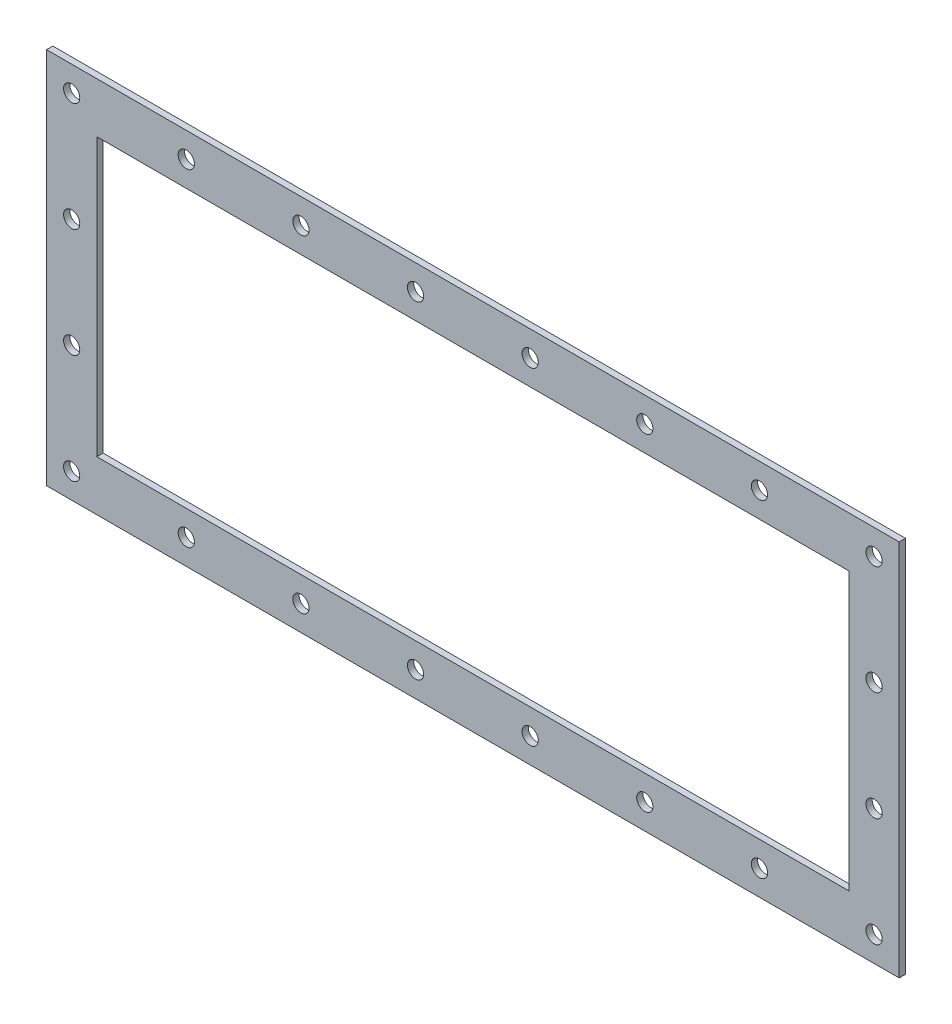
ISO-10303-21;
HEADER;
FILE_DESCRIPTION(('STEP AP214'),'2;1');
FILE_NAME('part.step','',(''),(''),'','','');
FILE_SCHEMA(('AUTOMOTIVE_DESIGN { 1 0 10303 214 1 1 1 1 }'));
ENDSEC;
DATA;
#1=APPLICATION_CONTEXT('core data for automotive mechanical design processes');
#2=APPLICATION_PROTOCOL_DEFINITION('international standard','automotive_design',2000,#1);
#3=PRODUCT_CONTEXT('',#1,'mechanical');
#4=PRODUCT('Part','Part','',(#3));
#5=PRODUCT_RELATED_PRODUCT_CATEGORY('part','',(#4));
#6=PRODUCT_DEFINITION_FORMATION('','',#4);
#7=PRODUCT_DEFINITION_CONTEXT('part definition',#1,'design');
#8=PRODUCT_DEFINITION('design','',#6,#7);
#9=PRODUCT_DEFINITION_SHAPE('','',#8);
#10=(LENGTH_UNIT() NAMED_UNIT(*) SI_UNIT(.MILLI.,.METRE.));
#11=(NAMED_UNIT(*) PLANE_ANGLE_UNIT() SI_UNIT($,.RADIAN.));
#12=(NAMED_UNIT(*) SI_UNIT($,.STERADIAN.) SOLID_ANGLE_UNIT());
#13=UNCERTAINTY_MEASURE_WITH_UNIT(LENGTH_MEASURE(1.E-05),#10,'distance_accuracy_value','');
#14=(GEOMETRIC_REPRESENTATION_CONTEXT(3) GLOBAL_UNCERTAINTY_ASSIGNED_CONTEXT((#13)) GLOBAL_UNIT_ASSIGNED_CONTEXT((#10,
#11,#12)) REPRESENTATION_CONTEXT('',''));
#15=CARTESIAN_POINT('',(0.,0.,0.));
#16=DIRECTION('',(0.,0.,1.));
#17=DIRECTION('',(1.,0.,0.));
#18=AXIS2_PLACEMENT_3D('',#15,#16,#17);
#19=CARTESIAN_POINT('',(0.,17.5,0.79375));
#20=DIRECTION('',(0.,1.,0.));
#21=DIRECTION('',(0.,0.,1.));
#22=AXIS2_PLACEMENT_3D('',#19,#20,#21);
#23=PLANE('',#22);
#24=DIRECTION('',(1.,0.,0.));
#25=VECTOR('',#24,1.);
#26=CARTESIAN_POINT('',(0.,17.5,0.));
#27=LINE('',#26,#25);
#28=CARTESIAN_POINT('',(-47.5,17.5,0.));
#29=VERTEX_POINT('',#28);
#30=CARTESIAN_POINT('',(47.5,17.5,0.));
#31=VERTEX_POINT('',#30);
#32=EDGE_CURVE('E243',#29,#31,#27,.T.);
#33=ORIENTED_EDGE('',*,*,#32,.T.);
#34=DIRECTION('',(0.,0.,-1.));
#35=VECTOR('',#34,1.);
#36=CARTESIAN_POINT('',(47.5,17.5,0.79375));
#37=LINE('',#36,#35);
#38=CARTESIAN_POINT('',(47.5,17.5,0.79375));
#39=VERTEX_POINT('',#38);
#40=EDGE_CURVE('E11',#39,#31,#37,.T.);
#41=ORIENTED_EDGE('',*,*,#40,.F.);
#42=DIRECTION('',(1.,0.,0.));
#43=VECTOR('',#42,1.);
#44=CARTESIAN_POINT('',(0.,17.5,0.79375));
#45=LINE('',#44,#43);
#46=CARTESIAN_POINT('',(-47.5,17.5,0.79375));
#47=VERTEX_POINT('',#46);
#48=EDGE_CURVE('E126',#47,#39,#45,.T.);
#49=ORIENTED_EDGE('',*,*,#48,.F.);
#50=DIRECTION('',(0.,0.,-1.));
#51=VECTOR('',#50,1.);
#52=CARTESIAN_POINT('',(-47.5,17.5,0.79375));
#53=LINE('',#52,#51);
#54=EDGE_CURVE('E65',#47,#29,#53,.T.);
#55=ORIENTED_EDGE('',*,*,#54,.T.);
#56=EDGE_LOOP('',(#33,#41,#49,#55));
#57=FACE_BOUND('',#56,.T.);
#58=ADVANCED_FACE('F45',(#57),#23,.F.);
#59=CARTESIAN_POINT('',(47.5,0.,0.79375));
#60=DIRECTION('',(1.,0.,0.));
#61=DIRECTION('',(0.,1.,0.));
#62=AXIS2_PLACEMENT_3D('',#59,#60,#61);
#63=PLANE('',#62);
#64=DIRECTION('',(0.,-1.,0.));
#65=VECTOR('',#64,1.);
#66=CARTESIAN_POINT('',(47.5,0.,0.));
#67=LINE('',#66,#65);
#68=CARTESIAN_POINT('',(47.5,-17.5,0.));
#69=VERTEX_POINT('',#68);
#70=EDGE_CURVE('E133',#31,#69,#67,.T.);
#71=ORIENTED_EDGE('',*,*,#70,.T.);
#72=DIRECTION('',(0.,0.,-1.));
#73=VECTOR('',#72,1.);
#74=CARTESIAN_POINT('',(47.5,-17.5,0.79375));
#75=LINE('',#74,#73);
#76=CARTESIAN_POINT('',(47.5,-17.5,0.79375));
#77=VERTEX_POINT('',#76);
#78=EDGE_CURVE('E56',#77,#69,#75,.T.);
#79=ORIENTED_EDGE('',*,*,#78,.F.);
#80=DIRECTION('',(0.,-1.,0.));
#81=VECTOR('',#80,1.);
#82=CARTESIAN_POINT('',(47.5,0.,0.79375));
#83=LINE('',#82,#81);
#84=EDGE_CURVE('E120',#39,#77,#83,.T.);
#85=ORIENTED_EDGE('',*,*,#84,.F.);
#86=ORIENTED_EDGE('',*,*,#40,.T.);
#87=EDGE_LOOP('',(#71,#79,#85,#86));
#88=FACE_BOUND('',#87,.T.);
#89=ADVANCED_FACE('F132',(#88),#63,.F.);
#90=CARTESIAN_POINT('',(0.,-17.5,0.79375));
#91=DIRECTION('',(0.,1.,0.));
#92=DIRECTION('',(0.,0.,1.));
#93=AXIS2_PLACEMENT_3D('',#90,#91,#92);
#94=PLANE('',#93);
#95=DIRECTION('',(1.,0.,0.));
#96=VECTOR('',#95,1.);
#97=CARTESIAN_POINT('',(0.,-17.5,0.));
#98=LINE('',#97,#96);
#99=CARTESIAN_POINT('',(-47.5,-17.5,0.));
#100=VERTEX_POINT('',#99);
#101=EDGE_CURVE('E248',#100,#69,#98,.T.);
#102=ORIENTED_EDGE('',*,*,#101,.F.);
#103=DIRECTION('',(0.,0.,-1.));
#104=VECTOR('',#103,1.);
#105=CARTESIAN_POINT('',(-47.5,-17.5,0.79375));
#106=LINE('',#105,#104);
#107=CARTESIAN_POINT('',(-47.5,-17.5,0.79375));
#108=VERTEX_POINT('',#107);
#109=EDGE_CURVE('E91',#108,#100,#106,.T.);
#110=ORIENTED_EDGE('',*,*,#109,.F.);
#111=DIRECTION('',(1.,0.,0.));
#112=VECTOR('',#111,1.);
#113=CARTESIAN_POINT('',(0.,-17.5,0.79375));
#114=LINE('',#113,#112);
#115=EDGE_CURVE('E125',#108,#77,#114,.T.);
#116=ORIENTED_EDGE('',*,*,#115,.T.);
#117=ORIENTED_EDGE('',*,*,#78,.T.);
#118=EDGE_LOOP('',(#102,#110,#116,#117));
#119=FACE_BOUND('',#118,.T.);
#120=ADVANCED_FACE('F138',(#119),#94,.T.);
#121=CARTESIAN_POINT('',(0.,-23.85,0.79375));
#122=DIRECTION('',(0.,1.,0.));
#123=DIRECTION('',(0.,0.,1.));
#124=AXIS2_PLACEMENT_3D('',#121,#122,#123);
#125=PLANE('',#124);
#126=DIRECTION('',(1.,0.,0.));
#127=VECTOR('',#126,1.);
#128=CARTESIAN_POINT('',(0.,-23.85,0.));
#129=LINE('',#128,#127);
#130=CARTESIAN_POINT('',(-53.85,-23.85,0.));
#131=VERTEX_POINT('',#130);
#132=CARTESIAN_POINT('',(53.85,-23.85,0.));
#133=VERTEX_POINT('',#132);
#134=EDGE_CURVE('E227',#131,#133,#129,.T.);
#135=ORIENTED_EDGE('',*,*,#134,.T.);
#136=DIRECTION('',(0.,0.,-1.));
#137=VECTOR('',#136,1.);
#138=CARTESIAN_POINT('',(53.85,-23.85,0.79375));
#139=LINE('',#138,#137);
#140=CARTESIAN_POINT('',(53.85,-23.85,0.79375));
#141=VERTEX_POINT('',#140);
#142=EDGE_CURVE('E49',#141,#133,#139,.T.);
#143=ORIENTED_EDGE('',*,*,#142,.F.);
#144=DIRECTION('',(1.,0.,0.));
#145=VECTOR('',#144,1.);
#146=CARTESIAN_POINT('',(0.,-23.85,0.79375));
#147=LINE('',#146,#145);
#148=CARTESIAN_POINT('',(-53.85,-23.85,0.79375));
#149=VERTEX_POINT('',#148);
#150=EDGE_CURVE('E394',#149,#141,#147,.T.);
#151=ORIENTED_EDGE('',*,*,#150,.F.);
#152=DIRECTION('',(0.,0.,-1.));
#153=VECTOR('',#152,1.);
#154=CARTESIAN_POINT('',(-53.85,-23.85,0.79375));
#155=LINE('',#154,#153);
#156=EDGE_CURVE('E143',#149,#131,#155,.T.);
#157=ORIENTED_EDGE('',*,*,#156,.T.);
#158=EDGE_LOOP('',(#135,#143,#151,#157));
#159=FACE_BOUND('',#158,.T.);
#160=ADVANCED_FACE('F275',(#159),#125,.F.);
#161=CARTESIAN_POINT('',(53.85,0.,0.79375));
#162=DIRECTION('',(-1.,0.,0.));
#163=DIRECTION('',(0.,0.,1.));
#164=AXIS2_PLACEMENT_3D('',#161,#162,#163);
#165=PLANE('',#164);
#166=DIRECTION('',(0.,1.,0.));
#167=VECTOR('',#166,1.);
#168=CARTESIAN_POINT('',(53.85,0.,0.));
#169=LINE('',#168,#167);
#170=CARTESIAN_POINT('',(53.85,23.85,0.));
#171=VERTEX_POINT('',#170);
#172=EDGE_CURVE('E231',#133,#171,#169,.T.);
#173=ORIENTED_EDGE('',*,*,#172,.T.);
#174=DIRECTION('',(0.,0.,-1.));
#175=VECTOR('',#174,1.);
#176=CARTESIAN_POINT('',(53.85,23.85,0.79375));
#177=LINE('',#176,#175);
#178=CARTESIAN_POINT('',(53.85,23.85,0.79375));
#179=VERTEX_POINT('',#178);
#180=EDGE_CURVE('E264',#179,#171,#177,.T.);
#181=ORIENTED_EDGE('',*,*,#180,.F.);
#182=DIRECTION('',(0.,1.,0.));
#183=VECTOR('',#182,1.);
#184=CARTESIAN_POINT('',(53.85,0.,0.79375));
#185=LINE('',#184,#183);
#186=EDGE_CURVE('E104',#141,#179,#185,.T.);
#187=ORIENTED_EDGE('',*,*,#186,.F.);
#188=ORIENTED_EDGE('',*,*,#142,.T.);
#189=EDGE_LOOP('',(#173,#181,#187,#188));
#190=FACE_BOUND('',#189,.T.);
#191=ADVANCED_FACE('F271',(#190),#165,.F.);
#192=CARTESIAN_POINT('',(0.,23.85,0.79375));
#193=DIRECTION('',(0.,1.,0.));
#194=DIRECTION('',(0.,0.,1.));
#195=AXIS2_PLACEMENT_3D('',#192,#193,#194);
#196=PLANE('',#195);
#197=DIRECTION('',(1.,0.,0.));
#198=VECTOR('',#197,1.);
#199=CARTESIAN_POINT('',(0.,23.85,0.));
#200=LINE('',#199,#198);
#201=CARTESIAN_POINT('',(-53.85,23.85,0.));
#202=VERTEX_POINT('',#201);
#203=EDGE_CURVE('E235',#202,#171,#200,.T.);
#204=ORIENTED_EDGE('',*,*,#203,.F.);
#205=DIRECTION('',(0.,0.,-1.));
#206=VECTOR('',#205,1.);
#207=CARTESIAN_POINT('',(-53.85,23.85,0.79375));
#208=LINE('',#207,#206);
#209=CARTESIAN_POINT('',(-53.85,23.85,0.79375));
#210=VERTEX_POINT('',#209);
#211=EDGE_CURVE('E262',#210,#202,#208,.T.);
#212=ORIENTED_EDGE('',*,*,#211,.F.);
#213=DIRECTION('',(1.,0.,0.));
#214=VECTOR('',#213,1.);
#215=CARTESIAN_POINT('',(0.,23.85,0.79375));
#216=LINE('',#215,#214);
#217=EDGE_CURVE('E399',#210,#179,#216,.T.);
#218=ORIENTED_EDGE('',*,*,#217,.T.);
#219=ORIENTED_EDGE('',*,*,#180,.T.);
#220=EDGE_LOOP('',(#204,#212,#218,#219));
#221=FACE_BOUND('',#220,.T.);
#222=ADVANCED_FACE('F286',(#221),#196,.T.);
#223=CARTESIAN_POINT('',(-53.85,0.,0.79375));
#224=DIRECTION('',(-1.,0.,0.));
#225=DIRECTION('',(0.,0.,1.));
#226=AXIS2_PLACEMENT_3D('',#223,#224,#225);
#227=PLANE('',#226);
#228=DIRECTION('',(0.,1.,0.));
#229=VECTOR('',#228,1.);
#230=CARTESIAN_POINT('',(-53.85,0.,0.));
#231=LINE('',#230,#229);
#232=EDGE_CURVE('E239',#131,#202,#231,.T.);
#233=ORIENTED_EDGE('',*,*,#232,.F.);
#234=ORIENTED_EDGE('',*,*,#156,.F.);
#235=DIRECTION('',(0.,1.,0.));
#236=VECTOR('',#235,1.);
#237=CARTESIAN_POINT('',(-53.85,0.,0.79375));
#238=LINE('',#237,#236);
#239=EDGE_CURVE('E284',#149,#210,#238,.T.);
#240=ORIENTED_EDGE('',*,*,#239,.T.);
#241=ORIENTED_EDGE('',*,*,#211,.T.);
#242=EDGE_LOOP('',(#233,#234,#240,#241));
#243=FACE_BOUND('',#242,.T.);
#244=ADVANCED_FACE('F281',(#243),#227,.T.);
#245=CARTESIAN_POINT('',(-50.675,20.675,0.79375));
#246=DIRECTION('',(0.,0.,-1.));
#247=DIRECTION('',(-1.,0.,0.));
#248=AXIS2_PLACEMENT_3D('',#245,#246,#247);
#249=CYLINDRICAL_SURFACE('',#248,1.025);
#250=CARTESIAN_POINT('',(-50.675,20.675,0.79375));
#251=DIRECTION('',(0.,0.,1.));
#252=DIRECTION('',(1.,0.,0.));
#253=AXIS2_PLACEMENT_3D('',#250,#251,#252);
#254=CIRCLE('',#253,1.025);
#255=CARTESIAN_POINT('',(-49.65,20.675,0.79375));
#256=VERTEX_POINT('',#255);
#257=EDGE_CURVE('E393',#256,#256,#254,.T.);
#258=ORIENTED_EDGE('',*,*,#257,.T.);
#259=EDGE_LOOP('',(#258));
#260=FACE_BOUND('',#259,.T.);
#261=CARTESIAN_POINT('',(-50.675,20.675,0.));
#262=DIRECTION('',(0.,0.,1.));
#263=DIRECTION('',(1.,0.,0.));
#264=AXIS2_PLACEMENT_3D('',#261,#262,#263);
#265=CIRCLE('',#264,1.025);
#266=CARTESIAN_POINT('',(-49.65,20.675,0.));
#267=VERTEX_POINT('',#266);
#268=EDGE_CURVE('E223',#267,#267,#265,.T.);
#269=ORIENTED_EDGE('',*,*,#268,.F.);
#270=EDGE_LOOP('',(#269));
#271=FACE_BOUND('',#270,.T.);
#272=ADVANCED_FACE('F293',(#260,#271),#249,.F.);
#273=CARTESIAN_POINT('',(50.675,20.675,0.79375));
#274=DIRECTION('',(0.,0.,-1.));
#275=DIRECTION('',(-1.,0.,0.));
#276=AXIS2_PLACEMENT_3D('',#273,#274,#275);
#277=CYLINDRICAL_SURFACE('',#276,1.025);
#278=CARTESIAN_POINT('',(50.675,20.675,0.79375));
#279=DIRECTION('',(0.,0.,1.));
#280=DIRECTION('',(1.,0.,0.));
#281=AXIS2_PLACEMENT_3D('',#278,#279,#280);
#282=CIRCLE('',#281,1.025);
#283=CARTESIAN_POINT('',(51.7,20.675,0.79375));
#284=VERTEX_POINT('',#283);
#285=EDGE_CURVE('E389',#284,#284,#282,.T.);
#286=ORIENTED_EDGE('',*,*,#285,.T.);
#287=EDGE_LOOP('',(#286));
#288=FACE_BOUND('',#287,.T.);
#289=CARTESIAN_POINT('',(50.675,20.675,0.));
#290=DIRECTION('',(0.,0.,1.));
#291=DIRECTION('',(1.,0.,0.));
#292=AXIS2_PLACEMENT_3D('',#289,#290,#291);
#293=CIRCLE('',#292,1.025);
#294=CARTESIAN_POINT('',(51.7,20.675,0.));
#295=VERTEX_POINT('',#294);
#296=EDGE_CURVE('E219',#295,#295,#293,.T.);
#297=ORIENTED_EDGE('',*,*,#296,.F.);
#298=EDGE_LOOP('',(#297));
#299=FACE_BOUND('',#298,.T.);
#300=ADVANCED_FACE('F490',(#288,#299),#277,.F.);
#301=CARTESIAN_POINT('',(-50.675,-20.675,0.79375));
#302=DIRECTION('',(0.,0.,-1.));
#303=DIRECTION('',(-1.,0.,0.));
#304=AXIS2_PLACEMENT_3D('',#301,#302,#303);
#305=CYLINDRICAL_SURFACE('',#304,1.025);
#306=CARTESIAN_POINT('',(-50.675,-20.675,0.79375));
#307=DIRECTION('',(0.,0.,1.));
#308=DIRECTION('',(1.,0.,0.));
#309=AXIS2_PLACEMENT_3D('',#306,#307,#308);
#310=CIRCLE('',#309,1.025);
#311=CARTESIAN_POINT('',(-49.65,-20.675,0.79375));
#312=VERTEX_POINT('',#311);
#313=EDGE_CURVE('E385',#312,#312,#310,.T.);
#314=ORIENTED_EDGE('',*,*,#313,.T.);
#315=EDGE_LOOP('',(#314));
#316=FACE_BOUND('',#315,.T.);
#317=CARTESIAN_POINT('',(-50.675,-20.675,0.));
#318=DIRECTION('',(0.,0.,1.));
#319=DIRECTION('',(1.,0.,0.));
#320=AXIS2_PLACEMENT_3D('',#317,#318,#319);
#321=CIRCLE('',#320,1.025);
#322=CARTESIAN_POINT('',(-49.65,-20.675,0.));
#323=VERTEX_POINT('',#322);
#324=EDGE_CURVE('E215',#323,#323,#321,.T.);
#325=ORIENTED_EDGE('',*,*,#324,.F.);
#326=EDGE_LOOP('',(#325));
#327=FACE_BOUND('',#326,.T.);
#328=ADVANCED_FACE('F496',(#316,#327),#305,.F.);
#329=CARTESIAN_POINT('',(50.675,-20.675,0.79375));
#330=DIRECTION('',(0.,0.,-1.));
#331=DIRECTION('',(-1.,0.,0.));
#332=AXIS2_PLACEMENT_3D('',#329,#330,#331);
#333=CYLINDRICAL_SURFACE('',#332,1.025);
#334=CARTESIAN_POINT('',(50.675,-20.675,0.79375));
#335=DIRECTION('',(0.,0.,1.));
#336=DIRECTION('',(1.,0.,0.));
#337=AXIS2_PLACEMENT_3D('',#334,#335,#336);
#338=CIRCLE('',#337,1.025);
#339=CARTESIAN_POINT('',(51.7,-20.675,0.79375));
#340=VERTEX_POINT('',#339);
#341=EDGE_CURVE('E381',#340,#340,#338,.T.);
#342=ORIENTED_EDGE('',*,*,#341,.T.);
#343=EDGE_LOOP('',(#342));
#344=FACE_BOUND('',#343,.T.);
#345=CARTESIAN_POINT('',(50.675,-20.675,0.));
#346=DIRECTION('',(0.,0.,1.));
#347=DIRECTION('',(1.,0.,0.));
#348=AXIS2_PLACEMENT_3D('',#345,#346,#347);
#349=CIRCLE('',#348,1.025);
#350=CARTESIAN_POINT('',(51.7,-20.675,0.));
#351=VERTEX_POINT('',#350);
#352=EDGE_CURVE('E211',#351,#351,#349,.T.);
#353=ORIENTED_EDGE('',*,*,#352,.F.);
#354=EDGE_LOOP('',(#353));
#355=FACE_BOUND('',#354,.T.);
#356=ADVANCED_FACE('F503',(#344,#355),#333,.F.);
#357=CARTESIAN_POINT('',(-7.2392857142,20.675,0.79375));
#358=DIRECTION('',(0.,0.,-1.));
#359=DIRECTION('',(-1.,0.,0.));
#360=AXIS2_PLACEMENT_3D('',#357,#358,#359);
#361=CYLINDRICAL_SURFACE('',#360,1.025);
#362=CARTESIAN_POINT('',(-7.2392857142,20.675,0.79375));
#363=DIRECTION('',(0.,0.,1.));
#364=DIRECTION('',(1.,0.,0.));
#365=AXIS2_PLACEMENT_3D('',#362,#363,#364);
#366=CIRCLE('',#365,1.025);
#367=CARTESIAN_POINT('',(-6.2142857142,20.675,0.79375));
#368=VERTEX_POINT('',#367);
#369=EDGE_CURVE('E377',#368,#368,#366,.T.);
#370=ORIENTED_EDGE('',*,*,#369,.T.);
#371=EDGE_LOOP('',(#370));
#372=FACE_BOUND('',#371,.T.);
#373=CARTESIAN_POINT('',(-7.2392857142,20.675,0.));
#374=DIRECTION('',(0.,0.,1.));
#375=DIRECTION('',(1.,0.,0.));
#376=AXIS2_PLACEMENT_3D('',#373,#374,#375);
#377=CIRCLE('',#376,1.025);
#378=CARTESIAN_POINT('',(-6.2142857142,20.675,0.));
#379=VERTEX_POINT('',#378);
#380=EDGE_CURVE('E207',#379,#379,#377,.T.);
#381=ORIENTED_EDGE('',*,*,#380,.F.);
#382=EDGE_LOOP('',(#381));
#383=FACE_BOUND('',#382,.T.);
#384=ADVANCED_FACE('F507',(#372,#383),#361,.F.);
#385=CARTESIAN_POINT('',(-7.2392857142,-20.675,0.79375));
#386=DIRECTION('',(0.,0.,-1.));
#387=DIRECTION('',(-1.,0.,0.));
#388=AXIS2_PLACEMENT_3D('',#385,#386,#387);
#389=CYLINDRICAL_SURFACE('',#388,1.025);
#390=CARTESIAN_POINT('',(-7.2392857142,-20.675,0.79375));
#391=DIRECTION('',(0.,0.,1.));
#392=DIRECTION('',(1.,0.,0.));
#393=AXIS2_PLACEMENT_3D('',#390,#391,#392);
#394=CIRCLE('',#393,1.025);
#395=CARTESIAN_POINT('',(-6.2142857142,-20.675,0.79375));
#396=VERTEX_POINT('',#395);
#397=EDGE_CURVE('E373',#396,#396,#394,.T.);
#398=ORIENTED_EDGE('',*,*,#397,.T.);
#399=EDGE_LOOP('',(#398));
#400=FACE_BOUND('',#399,.T.);
#401=CARTESIAN_POINT('',(-7.2392857142,-20.675,0.));
#402=DIRECTION('',(0.,0.,1.));
#403=DIRECTION('',(1.,0.,0.));
#404=AXIS2_PLACEMENT_3D('',#401,#402,#403);
#405=CIRCLE('',#404,1.025);
#406=CARTESIAN_POINT('',(-6.2142857142,-20.675,0.));
#407=VERTEX_POINT('',#406);
#408=EDGE_CURVE('E203',#407,#407,#405,.T.);
#409=ORIENTED_EDGE('',*,*,#408,.F.);
#410=EDGE_LOOP('',(#409));
#411=FACE_BOUND('',#410,.T.);
#412=ADVANCED_FACE('F511',(#400,#411),#389,.F.);
#413=CARTESIAN_POINT('',(-36.1964285714,20.675,0.79375));
#414=DIRECTION('',(0.,0.,-1.));
#415=DIRECTION('',(-1.,0.,0.));
#416=AXIS2_PLACEMENT_3D('',#413,#414,#415);
#417=CYLINDRICAL_SURFACE('',#416,1.025);
#418=CARTESIAN_POINT('',(-36.1964285714,20.675,0.79375));
#419=DIRECTION('',(0.,0.,1.));
#420=DIRECTION('',(1.,0.,0.));
#421=AXIS2_PLACEMENT_3D('',#418,#419,#420);
#422=CIRCLE('',#421,1.025);
#423=CARTESIAN_POINT('',(-35.1714285714,20.675,0.79375));
#424=VERTEX_POINT('',#423);
#425=EDGE_CURVE('E369',#424,#424,#422,.T.);
#426=ORIENTED_EDGE('',*,*,#425,.T.);
#427=EDGE_LOOP('',(#426));
#428=FACE_BOUND('',#427,.T.);
#429=CARTESIAN_POINT('',(-36.1964285714,20.675,0.));
#430=DIRECTION('',(0.,0.,1.));
#431=DIRECTION('',(1.,0.,0.));
#432=AXIS2_PLACEMENT_3D('',#429,#430,#431);
#433=CIRCLE('',#432,1.025);
#434=CARTESIAN_POINT('',(-35.1714285714,20.675,0.));
#435=VERTEX_POINT('',#434);
#436=EDGE_CURVE('E199',#435,#435,#433,.T.);
#437=ORIENTED_EDGE('',*,*,#436,.F.);
#438=EDGE_LOOP('',(#437));
#439=FACE_BOUND('',#438,.T.);
#440=ADVANCED_FACE('F515',(#428,#439),#417,.F.);
#441=CARTESIAN_POINT('',(-21.7178571428,20.675,0.79375));
#442=DIRECTION('',(0.,0.,-1.));
#443=DIRECTION('',(-1.,0.,0.));
#444=AXIS2_PLACEMENT_3D('',#441,#442,#443);
#445=CYLINDRICAL_SURFACE('',#444,1.025);
#446=CARTESIAN_POINT('',(-21.7178571428,20.675,0.79375));
#447=DIRECTION('',(0.,0.,1.));
#448=DIRECTION('',(1.,0.,0.));
#449=AXIS2_PLACEMENT_3D('',#446,#447,#448);
#450=CIRCLE('',#449,1.025);
#451=CARTESIAN_POINT('',(-20.6928571428,20.675,0.79375));
#452=VERTEX_POINT('',#451);
#453=EDGE_CURVE('E365',#452,#452,#450,.T.);
#454=ORIENTED_EDGE('',*,*,#453,.T.);
#455=EDGE_LOOP('',(#454));
#456=FACE_BOUND('',#455,.T.);
#457=CARTESIAN_POINT('',(-21.7178571428,20.675,0.));
#458=DIRECTION('',(0.,0.,1.));
#459=DIRECTION('',(1.,0.,0.));
#460=AXIS2_PLACEMENT_3D('',#457,#458,#459);
#461=CIRCLE('',#460,1.025);
#462=CARTESIAN_POINT('',(-20.6928571428,20.675,0.));
#463=VERTEX_POINT('',#462);
#464=EDGE_CURVE('E195',#463,#463,#461,.T.);
#465=ORIENTED_EDGE('',*,*,#464,.F.);
#466=EDGE_LOOP('',(#465));
#467=FACE_BOUND('',#466,.T.);
#468=ADVANCED_FACE('F519',(#456,#467),#445,.F.);
#469=CARTESIAN_POINT('',(7.2392857144,20.675,0.79375));
#470=DIRECTION('',(0.,0.,-1.));
#471=DIRECTION('',(-1.,0.,0.));
#472=AXIS2_PLACEMENT_3D('',#469,#470,#471);
#473=CYLINDRICAL_SURFACE('',#472,1.025);
#474=CARTESIAN_POINT('',(7.2392857144,20.675,0.79375));
#475=DIRECTION('',(0.,0.,1.));
#476=DIRECTION('',(1.,0.,0.));
#477=AXIS2_PLACEMENT_3D('',#474,#475,#476);
#478=CIRCLE('',#477,1.025);
#479=CARTESIAN_POINT('',(8.2642857144,20.675,0.79375));
#480=VERTEX_POINT('',#479);
#481=EDGE_CURVE('E361',#480,#480,#478,.T.);
#482=ORIENTED_EDGE('',*,*,#481,.T.);
#483=EDGE_LOOP('',(#482));
#484=FACE_BOUND('',#483,.T.);
#485=CARTESIAN_POINT('',(7.2392857144,20.675,0.));
#486=DIRECTION('',(0.,0.,1.));
#487=DIRECTION('',(1.,0.,0.));
#488=AXIS2_PLACEMENT_3D('',#485,#486,#487);
#489=CIRCLE('',#488,1.025);
#490=CARTESIAN_POINT('',(8.2642857144,20.675,0.));
#491=VERTEX_POINT('',#490);
#492=EDGE_CURVE('E191',#491,#491,#489,.T.);
#493=ORIENTED_EDGE('',*,*,#492,.F.);
#494=EDGE_LOOP('',(#493));
#495=FACE_BOUND('',#494,.T.);
#496=ADVANCED_FACE('F523',(#484,#495),#473,.F.);
#497=CARTESIAN_POINT('',(21.717857143,20.675,0.79375));
#498=DIRECTION('',(0.,0.,-1.));
#499=DIRECTION('',(-1.,0.,0.));
#500=AXIS2_PLACEMENT_3D('',#497,#498,#499);
#501=CYLINDRICAL_SURFACE('',#500,1.025);
#502=CARTESIAN_POINT('',(21.717857143,20.675,0.79375));
#503=DIRECTION('',(0.,0.,1.));
#504=DIRECTION('',(1.,0.,0.));
#505=AXIS2_PLACEMENT_3D('',#502,#503,#504);
#506=CIRCLE('',#505,1.025);
#507=CARTESIAN_POINT('',(22.742857143,20.675,0.79375));
#508=VERTEX_POINT('',#507);
#509=EDGE_CURVE('E357',#508,#508,#506,.T.);
#510=ORIENTED_EDGE('',*,*,#509,.T.);
#511=EDGE_LOOP('',(#510));
#512=FACE_BOUND('',#511,.T.);
#513=CARTESIAN_POINT('',(21.717857143,20.675,0.));
#514=DIRECTION('',(0.,0.,1.));
#515=DIRECTION('',(1.,0.,0.));
#516=AXIS2_PLACEMENT_3D('',#513,#514,#515);
#517=CIRCLE('',#516,1.025);
#518=CARTESIAN_POINT('',(22.742857143,20.675,0.));
#519=VERTEX_POINT('',#518);
#520=EDGE_CURVE('E187',#519,#519,#517,.T.);
#521=ORIENTED_EDGE('',*,*,#520,.F.);
#522=EDGE_LOOP('',(#521));
#523=FACE_BOUND('',#522,.T.);
#524=ADVANCED_FACE('F527',(#512,#523),#501,.F.);
#525=CARTESIAN_POINT('',(-50.675,6.89166670000001,0.79375));
#526=DIRECTION('',(0.,0.,-1.));
#527=DIRECTION('',(-1.,0.,0.));
#528=AXIS2_PLACEMENT_3D('',#525,#526,#527);
#529=CYLINDRICAL_SURFACE('',#528,1.025);
#530=CARTESIAN_POINT('',(-50.675,6.89166670000001,0.79375));
#531=DIRECTION('',(0.,0.,1.));
#532=DIRECTION('',(1.,0.,0.));
#533=AXIS2_PLACEMENT_3D('',#530,#531,#532);
#534=CIRCLE('',#533,1.025);
#535=CARTESIAN_POINT('',(-49.65,6.89166670000001,0.79375));
#536=VERTEX_POINT('',#535);
#537=EDGE_CURVE('E353',#536,#536,#534,.T.);
#538=ORIENTED_EDGE('',*,*,#537,.T.);
#539=EDGE_LOOP('',(#538));
#540=FACE_BOUND('',#539,.T.);
#541=CARTESIAN_POINT('',(-50.675,6.89166670000001,0.));
#542=DIRECTION('',(0.,0.,1.));
#543=DIRECTION('',(1.,0.,0.));
#544=AXIS2_PLACEMENT_3D('',#541,#542,#543);
#545=CIRCLE('',#544,1.025);
#546=CARTESIAN_POINT('',(-49.65,6.89166670000001,0.));
#547=VERTEX_POINT('',#546);
#548=EDGE_CURVE('E183',#547,#547,#545,.T.);
#549=ORIENTED_EDGE('',*,*,#548,.F.);
#550=EDGE_LOOP('',(#549));
#551=FACE_BOUND('',#550,.T.);
#552=ADVANCED_FACE('F531',(#540,#551),#529,.F.);
#553=CARTESIAN_POINT('',(-50.675,-6.8916667,0.79375));
#554=DIRECTION('',(0.,0.,-1.));
#555=DIRECTION('',(-1.,0.,0.));
#556=AXIS2_PLACEMENT_3D('',#553,#554,#555);
#557=CYLINDRICAL_SURFACE('',#556,1.025);
#558=CARTESIAN_POINT('',(-50.675,-6.8916667,0.79375));
#559=DIRECTION('',(0.,0.,1.));
#560=DIRECTION('',(1.,0.,0.));
#561=AXIS2_PLACEMENT_3D('',#558,#559,#560);
#562=CIRCLE('',#561,1.025);
#563=CARTESIAN_POINT('',(-49.65,-6.8916667,0.79375));
#564=VERTEX_POINT('',#563);
#565=EDGE_CURVE('E349',#564,#564,#562,.T.);
#566=ORIENTED_EDGE('',*,*,#565,.T.);
#567=EDGE_LOOP('',(#566));
#568=FACE_BOUND('',#567,.T.);
#569=CARTESIAN_POINT('',(-50.675,-6.8916667,0.));
#570=DIRECTION('',(0.,0.,1.));
#571=DIRECTION('',(1.,0.,0.));
#572=AXIS2_PLACEMENT_3D('',#569,#570,#571);
#573=CIRCLE('',#572,1.025);
#574=CARTESIAN_POINT('',(-49.65,-6.8916667,0.));
#575=VERTEX_POINT('',#574);
#576=EDGE_CURVE('E179',#575,#575,#573,.T.);
#577=ORIENTED_EDGE('',*,*,#576,.F.);
#578=EDGE_LOOP('',(#577));
#579=FACE_BOUND('',#578,.T.);
#580=ADVANCED_FACE('F535',(#568,#579),#557,.F.);
#581=CARTESIAN_POINT('',(50.675,6.89166670000002,0.79375));
#582=DIRECTION('',(0.,0.,-1.));
#583=DIRECTION('',(-1.,0.,0.));
#584=AXIS2_PLACEMENT_3D('',#581,#582,#583);
#585=CYLINDRICAL_SURFACE('',#584,1.025);
#586=CARTESIAN_POINT('',(50.675,6.89166670000002,0.79375));
#587=DIRECTION('',(0.,0.,1.));
#588=DIRECTION('',(1.,0.,0.));
#589=AXIS2_PLACEMENT_3D('',#586,#587,#588);
#590=CIRCLE('',#589,1.025);
#591=CARTESIAN_POINT('',(51.7,6.89166670000002,0.79375));
#592=VERTEX_POINT('',#591);
#593=EDGE_CURVE('E345',#592,#592,#590,.T.);
#594=ORIENTED_EDGE('',*,*,#593,.T.);
#595=EDGE_LOOP('',(#594));
#596=FACE_BOUND('',#595,.T.);
#597=CARTESIAN_POINT('',(50.675,6.89166670000002,0.));
#598=DIRECTION('',(0.,0.,1.));
#599=DIRECTION('',(1.,0.,0.));
#600=AXIS2_PLACEMENT_3D('',#597,#598,#599);
#601=CIRCLE('',#600,1.025);
#602=CARTESIAN_POINT('',(51.7,6.89166670000002,0.));
#603=VERTEX_POINT('',#602);
#604=EDGE_CURVE('E175',#603,#603,#601,.T.);
#605=ORIENTED_EDGE('',*,*,#604,.F.);
#606=EDGE_LOOP('',(#605));
#607=FACE_BOUND('',#606,.T.);
#608=ADVANCED_FACE('F539',(#596,#607),#585,.F.);
#609=CARTESIAN_POINT('',(50.675,-6.89166669999998,0.79375));
#610=DIRECTION('',(0.,0.,-1.));
#611=DIRECTION('',(-1.,0.,0.));
#612=AXIS2_PLACEMENT_3D('',#609,#610,#611);
#613=CYLINDRICAL_SURFACE('',#612,1.025);
#614=CARTESIAN_POINT('',(50.675,-6.89166669999998,0.79375));
#615=DIRECTION('',(0.,0.,1.));
#616=DIRECTION('',(1.,0.,0.));
#617=AXIS2_PLACEMENT_3D('',#614,#615,#616);
#618=CIRCLE('',#617,1.025);
#619=CARTESIAN_POINT('',(51.7,-6.89166669999998,0.79375));
#620=VERTEX_POINT('',#619);
#621=EDGE_CURVE('E341',#620,#620,#618,.T.);
#622=ORIENTED_EDGE('',*,*,#621,.T.);
#623=EDGE_LOOP('',(#622));
#624=FACE_BOUND('',#623,.T.);
#625=CARTESIAN_POINT('',(50.675,-6.89166669999998,0.));
#626=DIRECTION('',(0.,0.,1.));
#627=DIRECTION('',(1.,0.,0.));
#628=AXIS2_PLACEMENT_3D('',#625,#626,#627);
#629=CIRCLE('',#628,1.025);
#630=CARTESIAN_POINT('',(51.7,-6.89166669999998,0.));
#631=VERTEX_POINT('',#630);
#632=EDGE_CURVE('E171',#631,#631,#629,.T.);
#633=ORIENTED_EDGE('',*,*,#632,.F.);
#634=EDGE_LOOP('',(#633));
#635=FACE_BOUND('',#634,.T.);
#636=ADVANCED_FACE('F543',(#624,#635),#613,.F.);
#637=CARTESIAN_POINT('',(7.2392857144,-20.675,0.79375));
#638=DIRECTION('',(0.,0.,-1.));
#639=DIRECTION('',(-1.,0.,0.));
#640=AXIS2_PLACEMENT_3D('',#637,#638,#639);
#641=CYLINDRICAL_SURFACE('',#640,1.025);
#642=CARTESIAN_POINT('',(7.2392857144,-20.675,0.79375));
#643=DIRECTION('',(0.,0.,1.));
#644=DIRECTION('',(1.,0.,0.));
#645=AXIS2_PLACEMENT_3D('',#642,#643,#644);
#646=CIRCLE('',#645,1.025);
#647=CARTESIAN_POINT('',(8.2642857144,-20.675,0.79375));
#648=VERTEX_POINT('',#647);
#649=EDGE_CURVE('E337',#648,#648,#646,.T.);
#650=ORIENTED_EDGE('',*,*,#649,.T.);
#651=EDGE_LOOP('',(#650));
#652=FACE_BOUND('',#651,.T.);
#653=CARTESIAN_POINT('',(7.2392857144,-20.675,0.));
#654=DIRECTION('',(0.,0.,1.));
#655=DIRECTION('',(1.,0.,0.));
#656=AXIS2_PLACEMENT_3D('',#653,#654,#655);
#657=CIRCLE('',#656,1.025);
#658=CARTESIAN_POINT('',(8.2642857144,-20.675,0.));
#659=VERTEX_POINT('',#658);
#660=EDGE_CURVE('E167',#659,#659,#657,.T.);
#661=ORIENTED_EDGE('',*,*,#660,.F.);
#662=EDGE_LOOP('',(#661));
#663=FACE_BOUND('',#662,.T.);
#664=ADVANCED_FACE('F547',(#652,#663),#641,.F.);
#665=CARTESIAN_POINT('',(21.717857143,-20.675,0.79375));
#666=DIRECTION('',(0.,0.,-1.));
#667=DIRECTION('',(-1.,0.,0.));
#668=AXIS2_PLACEMENT_3D('',#665,#666,#667);
#669=CYLINDRICAL_SURFACE('',#668,1.025);
#670=CARTESIAN_POINT('',(21.717857143,-20.675,0.79375));
#671=DIRECTION('',(0.,0.,1.));
#672=DIRECTION('',(1.,0.,0.));
#673=AXIS2_PLACEMENT_3D('',#670,#671,#672);
#674=CIRCLE('',#673,1.025);
#675=CARTESIAN_POINT('',(22.742857143,-20.675,0.79375));
#676=VERTEX_POINT('',#675);
#677=EDGE_CURVE('E333',#676,#676,#674,.T.);
#678=ORIENTED_EDGE('',*,*,#677,.T.);
#679=EDGE_LOOP('',(#678));
#680=FACE_BOUND('',#679,.T.);
#681=CARTESIAN_POINT('',(21.717857143,-20.675,0.));
#682=DIRECTION('',(0.,0.,1.));
#683=DIRECTION('',(1.,0.,0.));
#684=AXIS2_PLACEMENT_3D('',#681,#682,#683);
#685=CIRCLE('',#684,1.025);
#686=CARTESIAN_POINT('',(22.742857143,-20.675,0.));
#687=VERTEX_POINT('',#686);
#688=EDGE_CURVE('E163',#687,#687,#685,.T.);
#689=ORIENTED_EDGE('',*,*,#688,.F.);
#690=EDGE_LOOP('',(#689));
#691=FACE_BOUND('',#690,.T.);
#692=ADVANCED_FACE('F551',(#680,#691),#669,.F.);
#693=CARTESIAN_POINT('',(-21.7178571428,-20.675,0.79375));
#694=DIRECTION('',(0.,0.,-1.));
#695=DIRECTION('',(-1.,0.,0.));
#696=AXIS2_PLACEMENT_3D('',#693,#694,#695);
#697=CYLINDRICAL_SURFACE('',#696,1.02499999999999);
#698=CARTESIAN_POINT('',(-21.7178571428,-20.675,0.79375));
#699=DIRECTION('',(0.,0.,1.));
#700=DIRECTION('',(1.,0.,0.));
#701=AXIS2_PLACEMENT_3D('',#698,#699,#700);
#702=CIRCLE('',#701,1.02499999999999);
#703=CARTESIAN_POINT('',(-20.6928571428,-20.675,0.79375));
#704=VERTEX_POINT('',#703);
#705=EDGE_CURVE('E329',#704,#704,#702,.T.);
#706=ORIENTED_EDGE('',*,*,#705,.T.);
#707=EDGE_LOOP('',(#706));
#708=FACE_BOUND('',#707,.T.);
#709=CARTESIAN_POINT('',(-21.7178571428,-20.675,0.));
#710=DIRECTION('',(0.,0.,1.));
#711=DIRECTION('',(1.,0.,0.));
#712=AXIS2_PLACEMENT_3D('',#709,#710,#711);
#713=CIRCLE('',#712,1.02499999999999);
#714=CARTESIAN_POINT('',(-20.6928571428,-20.675,0.));
#715=VERTEX_POINT('',#714);
#716=EDGE_CURVE('E159',#715,#715,#713,.T.);
#717=ORIENTED_EDGE('',*,*,#716,.F.);
#718=EDGE_LOOP('',(#717));
#719=FACE_BOUND('',#718,.T.);
#720=ADVANCED_FACE('F555',(#708,#719),#697,.F.);
#721=CARTESIAN_POINT('',(-36.1964285714,-20.675,0.79375));
#722=DIRECTION('',(0.,0.,-1.));
#723=DIRECTION('',(-1.,0.,0.));
#724=AXIS2_PLACEMENT_3D('',#721,#722,#723);
#725=CYLINDRICAL_SURFACE('',#724,1.025);
#726=CARTESIAN_POINT('',(-36.1964285714,-20.675,0.79375));
#727=DIRECTION('',(0.,0.,1.));
#728=DIRECTION('',(1.,0.,0.));
#729=AXIS2_PLACEMENT_3D('',#726,#727,#728);
#730=CIRCLE('',#729,1.025);
#731=CARTESIAN_POINT('',(-35.1714285714,-20.675,0.79375));
#732=VERTEX_POINT('',#731);
#733=EDGE_CURVE('E325',#732,#732,#730,.T.);
#734=ORIENTED_EDGE('',*,*,#733,.T.);
#735=EDGE_LOOP('',(#734));
#736=FACE_BOUND('',#735,.T.);
#737=CARTESIAN_POINT('',(-36.1964285714,-20.675,0.));
#738=DIRECTION('',(0.,0.,1.));
#739=DIRECTION('',(1.,0.,0.));
#740=AXIS2_PLACEMENT_3D('',#737,#738,#739);
#741=CIRCLE('',#740,1.025);
#742=CARTESIAN_POINT('',(-35.1714285714,-20.675,0.));
#743=VERTEX_POINT('',#742);
#744=EDGE_CURVE('E155',#743,#743,#741,.T.);
#745=ORIENTED_EDGE('',*,*,#744,.F.);
#746=EDGE_LOOP('',(#745));
#747=FACE_BOUND('',#746,.T.);
#748=ADVANCED_FACE('F559',(#736,#747),#725,.F.);
#749=CARTESIAN_POINT('',(36.1964285716,20.675,0.79375));
#750=DIRECTION('',(0.,0.,-1.));
#751=DIRECTION('',(-1.,0.,0.));
#752=AXIS2_PLACEMENT_3D('',#749,#750,#751);
#753=CYLINDRICAL_SURFACE('',#752,1.025);
#754=CARTESIAN_POINT('',(36.1964285716,20.675,0.79375));
#755=DIRECTION('',(0.,0.,1.));
#756=DIRECTION('',(1.,0.,0.));
#757=AXIS2_PLACEMENT_3D('',#754,#755,#756);
#758=CIRCLE('',#757,1.025);
#759=CARTESIAN_POINT('',(37.2214285716,20.675,0.79375));
#760=VERTEX_POINT('',#759);
#761=EDGE_CURVE('E321',#760,#760,#758,.T.);
#762=ORIENTED_EDGE('',*,*,#761,.T.);
#763=EDGE_LOOP('',(#762));
#764=FACE_BOUND('',#763,.T.);
#765=CARTESIAN_POINT('',(36.1964285716,20.675,0.));
#766=DIRECTION('',(0.,0.,1.));
#767=DIRECTION('',(1.,0.,0.));
#768=AXIS2_PLACEMENT_3D('',#765,#766,#767);
#769=CIRCLE('',#768,1.025);
#770=CARTESIAN_POINT('',(37.2214285716,20.675,0.));
#771=VERTEX_POINT('',#770);
#772=EDGE_CURVE('E151',#771,#771,#769,.T.);
#773=ORIENTED_EDGE('',*,*,#772,.F.);
#774=EDGE_LOOP('',(#773));
#775=FACE_BOUND('',#774,.T.);
#776=ADVANCED_FACE('F448',(#764,#775),#753,.F.);
#777=CARTESIAN_POINT('',(36.1964285716,-20.675,0.79375));
#778=DIRECTION('',(0.,0.,-1.));
#779=DIRECTION('',(-1.,0.,0.));
#780=AXIS2_PLACEMENT_3D('',#777,#778,#779);
#781=CYLINDRICAL_SURFACE('',#780,1.025);
#782=CARTESIAN_POINT('',(36.1964285716,-20.675,0.79375));
#783=DIRECTION('',(0.,0.,1.));
#784=DIRECTION('',(1.,0.,0.));
#785=AXIS2_PLACEMENT_3D('',#782,#783,#784);
#786=CIRCLE('',#785,1.025);
#787=CARTESIAN_POINT('',(37.2214285716,-20.675,0.79375));
#788=VERTEX_POINT('',#787);
#789=EDGE_CURVE('E255',#788,#788,#786,.T.);
#790=ORIENTED_EDGE('',*,*,#789,.T.);
#791=EDGE_LOOP('',(#790));
#792=FACE_BOUND('',#791,.T.);
#793=CARTESIAN_POINT('',(36.1964285716,-20.675,0.));
#794=DIRECTION('',(0.,0.,1.));
#795=DIRECTION('',(1.,0.,0.));
#796=AXIS2_PLACEMENT_3D('',#793,#794,#795);
#797=CIRCLE('',#796,1.025);
#798=CARTESIAN_POINT('',(37.2214285716,-20.675,0.));
#799=VERTEX_POINT('',#798);
#800=EDGE_CURVE('E147',#799,#799,#797,.T.);
#801=ORIENTED_EDGE('',*,*,#800,.F.);
#802=EDGE_LOOP('',(#801));
#803=FACE_BOUND('',#802,.T.);
#804=ADVANCED_FACE('F47',(#792,#803),#781,.F.);
#805=CARTESIAN_POINT('',(-47.5,0.,0.79375));
#806=DIRECTION('',(1.,0.,0.));
#807=DIRECTION('',(0.,1.,0.));
#808=AXIS2_PLACEMENT_3D('',#805,#806,#807);
#809=PLANE('',#808);
#810=DIRECTION('',(0.,-1.,0.));
#811=VECTOR('',#810,1.);
#812=CARTESIAN_POINT('',(-47.5,0.,0.));
#813=LINE('',#812,#811);
#814=EDGE_CURVE('E251',#29,#100,#813,.T.);
#815=ORIENTED_EDGE('',*,*,#814,.F.);
#816=ORIENTED_EDGE('',*,*,#54,.F.);
#817=DIRECTION('',(0.,-1.,0.));
#818=VECTOR('',#817,1.);
#819=CARTESIAN_POINT('',(-47.5,0.,0.79375));
#820=LINE('',#819,#818);
#821=EDGE_CURVE('E140',#47,#108,#820,.T.);
#822=ORIENTED_EDGE('',*,*,#821,.T.);
#823=ORIENTED_EDGE('',*,*,#109,.T.);
#824=EDGE_LOOP('',(#815,#816,#822,#823));
#825=FACE_BOUND('',#824,.T.);
#826=ADVANCED_FACE('F305',(#825),#809,.T.);
#827=CARTESIAN_POINT('',(0.,0.,0.79375));
#828=DIRECTION('',(0.,0.,1.));
#829=DIRECTION('',(1.,0.,0.));
#830=AXIS2_PLACEMENT_3D('',#827,#828,#829);
#831=PLANE('',#830);
#832=ORIENTED_EDGE('',*,*,#789,.F.);
#833=EDGE_LOOP('',(#832));
#834=FACE_BOUND('',#833,.T.);
#835=ORIENTED_EDGE('',*,*,#761,.F.);
#836=EDGE_LOOP('',(#835));
#837=FACE_BOUND('',#836,.T.);
#838=ORIENTED_EDGE('',*,*,#733,.F.);
#839=EDGE_LOOP('',(#838));
#840=FACE_BOUND('',#839,.T.);
#841=ORIENTED_EDGE('',*,*,#705,.F.);
#842=EDGE_LOOP('',(#841));
#843=FACE_BOUND('',#842,.T.);
#844=ORIENTED_EDGE('',*,*,#677,.F.);
#845=EDGE_LOOP('',(#844));
#846=FACE_BOUND('',#845,.T.);
#847=ORIENTED_EDGE('',*,*,#649,.F.);
#848=EDGE_LOOP('',(#847));
#849=FACE_BOUND('',#848,.T.);
#850=ORIENTED_EDGE('',*,*,#621,.F.);
#851=EDGE_LOOP('',(#850));
#852=FACE_BOUND('',#851,.T.);
#853=ORIENTED_EDGE('',*,*,#593,.F.);
#854=EDGE_LOOP('',(#853));
#855=FACE_BOUND('',#854,.T.);
#856=ORIENTED_EDGE('',*,*,#565,.F.);
#857=EDGE_LOOP('',(#856));
#858=FACE_BOUND('',#857,.T.);
#859=ORIENTED_EDGE('',*,*,#537,.F.);
#860=EDGE_LOOP('',(#859));
#861=FACE_BOUND('',#860,.T.);
#862=ORIENTED_EDGE('',*,*,#509,.F.);
#863=EDGE_LOOP('',(#862));
#864=FACE_BOUND('',#863,.T.);
#865=ORIENTED_EDGE('',*,*,#481,.F.);
#866=EDGE_LOOP('',(#865));
#867=FACE_BOUND('',#866,.T.);
#868=ORIENTED_EDGE('',*,*,#453,.F.);
#869=EDGE_LOOP('',(#868));
#870=FACE_BOUND('',#869,.T.);
#871=ORIENTED_EDGE('',*,*,#425,.F.);
#872=EDGE_LOOP('',(#871));
#873=FACE_BOUND('',#872,.T.);
#874=ORIENTED_EDGE('',*,*,#397,.F.);
#875=EDGE_LOOP('',(#874));
#876=FACE_BOUND('',#875,.T.);
#877=ORIENTED_EDGE('',*,*,#369,.F.);
#878=EDGE_LOOP('',(#877));
#879=FACE_BOUND('',#878,.T.);
#880=ORIENTED_EDGE('',*,*,#341,.F.);
#881=EDGE_LOOP('',(#880));
#882=FACE_BOUND('',#881,.T.);
#883=ORIENTED_EDGE('',*,*,#313,.F.);
#884=EDGE_LOOP('',(#883));
#885=FACE_BOUND('',#884,.T.);
#886=ORIENTED_EDGE('',*,*,#285,.F.);
#887=EDGE_LOOP('',(#886));
#888=FACE_BOUND('',#887,.T.);
#889=ORIENTED_EDGE('',*,*,#257,.F.);
#890=EDGE_LOOP('',(#889));
#891=FACE_BOUND('',#890,.T.);
#892=ORIENTED_EDGE('',*,*,#150,.T.);
#893=ORIENTED_EDGE('',*,*,#186,.T.);
#894=ORIENTED_EDGE('',*,*,#217,.F.);
#895=ORIENTED_EDGE('',*,*,#239,.F.);
#896=EDGE_LOOP('',(#892,#893,#894,#895));
#897=FACE_BOUND('',#896,.T.);
#898=ORIENTED_EDGE('',*,*,#48,.T.);
#899=ORIENTED_EDGE('',*,*,#84,.T.);
#900=ORIENTED_EDGE('',*,*,#115,.F.);
#901=ORIENTED_EDGE('',*,*,#821,.F.);
#902=EDGE_LOOP('',(#898,#899,#900,#901));
#903=FACE_BOUND('',#902,.T.);
#904=ADVANCED_FACE('F122',(#834,#837,#840,#843,#846,#849,#852,#855,#858,#861,#864,#867,#870,
#873,#876,#879,#882,#885,#888,#891,#897,#903),#831,.T.);
#905=CARTESIAN_POINT('',(0.,0.,0.));
#906=DIRECTION('',(0.,0.,1.));
#907=DIRECTION('',(1.,0.,0.));
#908=AXIS2_PLACEMENT_3D('',#905,#906,#907);
#909=PLANE('',#908);
#910=ORIENTED_EDGE('',*,*,#800,.T.);
#911=EDGE_LOOP('',(#910));
#912=FACE_BOUND('',#911,.T.);
#913=ORIENTED_EDGE('',*,*,#772,.T.);
#914=EDGE_LOOP('',(#913));
#915=FACE_BOUND('',#914,.T.);
#916=ORIENTED_EDGE('',*,*,#744,.T.);
#917=EDGE_LOOP('',(#916));
#918=FACE_BOUND('',#917,.T.);
#919=ORIENTED_EDGE('',*,*,#716,.T.);
#920=EDGE_LOOP('',(#919));
#921=FACE_BOUND('',#920,.T.);
#922=ORIENTED_EDGE('',*,*,#688,.T.);
#923=EDGE_LOOP('',(#922));
#924=FACE_BOUND('',#923,.T.);
#925=ORIENTED_EDGE('',*,*,#660,.T.);
#926=EDGE_LOOP('',(#925));
#927=FACE_BOUND('',#926,.T.);
#928=ORIENTED_EDGE('',*,*,#632,.T.);
#929=EDGE_LOOP('',(#928));
#930=FACE_BOUND('',#929,.T.);
#931=ORIENTED_EDGE('',*,*,#604,.T.);
#932=EDGE_LOOP('',(#931));
#933=FACE_BOUND('',#932,.T.);
#934=ORIENTED_EDGE('',*,*,#576,.T.);
#935=EDGE_LOOP('',(#934));
#936=FACE_BOUND('',#935,.T.);
#937=ORIENTED_EDGE('',*,*,#548,.T.);
#938=EDGE_LOOP('',(#937));
#939=FACE_BOUND('',#938,.T.);
#940=ORIENTED_EDGE('',*,*,#520,.T.);
#941=EDGE_LOOP('',(#940));
#942=FACE_BOUND('',#941,.T.);
#943=ORIENTED_EDGE('',*,*,#492,.T.);
#944=EDGE_LOOP('',(#943));
#945=FACE_BOUND('',#944,.T.);
#946=ORIENTED_EDGE('',*,*,#464,.T.);
#947=EDGE_LOOP('',(#946));
#948=FACE_BOUND('',#947,.T.);
#949=ORIENTED_EDGE('',*,*,#436,.T.);
#950=EDGE_LOOP('',(#949));
#951=FACE_BOUND('',#950,.T.);
#952=ORIENTED_EDGE('',*,*,#408,.T.);
#953=EDGE_LOOP('',(#952));
#954=FACE_BOUND('',#953,.T.);
#955=ORIENTED_EDGE('',*,*,#380,.T.);
#956=EDGE_LOOP('',(#955));
#957=FACE_BOUND('',#956,.T.);
#958=ORIENTED_EDGE('',*,*,#352,.T.);
#959=EDGE_LOOP('',(#958));
#960=FACE_BOUND('',#959,.T.);
#961=ORIENTED_EDGE('',*,*,#324,.T.);
#962=EDGE_LOOP('',(#961));
#963=FACE_BOUND('',#962,.T.);
#964=ORIENTED_EDGE('',*,*,#296,.T.);
#965=EDGE_LOOP('',(#964));
#966=FACE_BOUND('',#965,.T.);
#967=ORIENTED_EDGE('',*,*,#268,.T.);
#968=EDGE_LOOP('',(#967));
#969=FACE_BOUND('',#968,.T.);
#970=ORIENTED_EDGE('',*,*,#134,.F.);
#971=ORIENTED_EDGE('',*,*,#232,.T.);
#972=ORIENTED_EDGE('',*,*,#203,.T.);
#973=ORIENTED_EDGE('',*,*,#172,.F.);
#974=EDGE_LOOP('',(#970,#971,#972,#973));
#975=FACE_BOUND('',#974,.T.);
#976=ORIENTED_EDGE('',*,*,#32,.F.);
#977=ORIENTED_EDGE('',*,*,#814,.T.);
#978=ORIENTED_EDGE('',*,*,#101,.T.);
#979=ORIENTED_EDGE('',*,*,#70,.F.);
#980=EDGE_LOOP('',(#976,#977,#978,#979));
#981=FACE_BOUND('',#980,.T.);
#982=ADVANCED_FACE('F278',(#912,#915,#918,#921,#924,#927,#930,#933,#936,#939,#942,#945,#948,
#951,#954,#957,#960,#963,#966,#969,#975,#981),#909,.F.);
#983=CLOSED_SHELL('',(#58,#89,#120,#160,#191,#222,#244,#272,#300,#328,#356,#384,#412,#440,#468,
#496,#524,#552,#580,#608,#636,#664,#692,#720,#748,#776,#804,#826,#904,#982));
#984=MANIFOLD_SOLID_BREP('B2',#983);
#985=ADVANCED_BREP_SHAPE_REPRESENTATION('',(#18,#984),#14);
#986=SHAPE_DEFINITION_REPRESENTATION(#9,#985);
ENDSEC;
END-ISO-10303-21;
